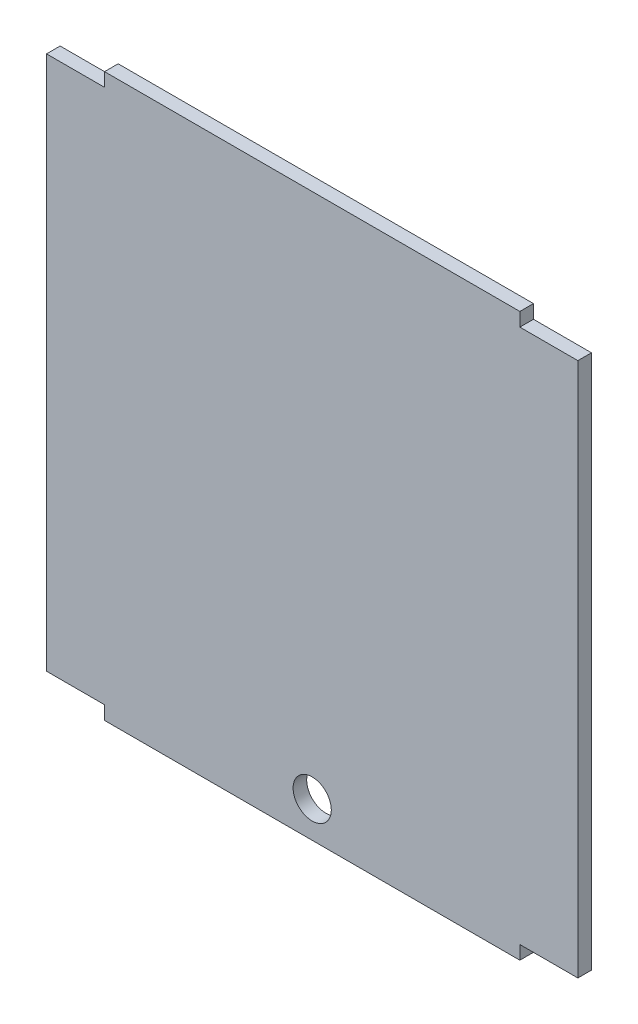
ISO-10303-21;
HEADER;
FILE_DESCRIPTION(('STEP AP214'),'2;1');
FILE_NAME('part.step','',(''),(''),'','','');
FILE_SCHEMA(('AUTOMOTIVE_DESIGN { 1 0 10303 214 1 1 1 1 }'));
ENDSEC;
DATA;
#1=APPLICATION_CONTEXT('core data for automotive mechanical design processes');
#2=APPLICATION_PROTOCOL_DEFINITION('international standard','automotive_design',2000,#1);
#3=PRODUCT_CONTEXT('',#1,'mechanical');
#4=PRODUCT('Part','Part','',(#3));
#5=PRODUCT_RELATED_PRODUCT_CATEGORY('part','',(#4));
#6=PRODUCT_DEFINITION_FORMATION('','',#4);
#7=PRODUCT_DEFINITION_CONTEXT('part definition',#1,'design');
#8=PRODUCT_DEFINITION('design','',#6,#7);
#9=PRODUCT_DEFINITION_SHAPE('','',#8);
#10=(LENGTH_UNIT() NAMED_UNIT(*) SI_UNIT(.MILLI.,.METRE.));
#11=(NAMED_UNIT(*) PLANE_ANGLE_UNIT() SI_UNIT($,.RADIAN.));
#12=(NAMED_UNIT(*) SI_UNIT($,.STERADIAN.) SOLID_ANGLE_UNIT());
#13=UNCERTAINTY_MEASURE_WITH_UNIT(LENGTH_MEASURE(1.E-05),#10,'distance_accuracy_value','');
#14=(GEOMETRIC_REPRESENTATION_CONTEXT(3) GLOBAL_UNCERTAINTY_ASSIGNED_CONTEXT((#13)) GLOBAL_UNIT_ASSIGNED_CONTEXT((#10,
#11,#12)) REPRESENTATION_CONTEXT('',''));
#15=CARTESIAN_POINT('',(0.,0.,0.));
#16=DIRECTION('',(0.,0.,1.));
#17=DIRECTION('',(1.,0.,0.));
#18=AXIS2_PLACEMENT_3D('',#15,#16,#17);
#19=CARTESIAN_POINT('',(0.,0.,5.7));
#20=DIRECTION('',(1.,0.,0.));
#21=DIRECTION('',(0.,0.,-1.));
#22=AXIS2_PLACEMENT_3D('',#19,#20,#21);
#23=PLANE('',#22);
#24=DIRECTION('',(0.,-1.,0.));
#25=VECTOR('',#24,1.);
#26=CARTESIAN_POINT('',(0.,0.,0.));
#27=LINE('',#26,#25);
#28=CARTESIAN_POINT('',(0.,224.,0.));
#29=VERTEX_POINT('',#28);
#30=CARTESIAN_POINT('',(0.,0.,0.));
#31=VERTEX_POINT('',#30);
#32=EDGE_CURVE('E152',#29,#31,#27,.T.);
#33=ORIENTED_EDGE('',*,*,#32,.T.);
#34=DIRECTION('',(0.,0.,-1.));
#35=VECTOR('',#34,1.);
#36=CARTESIAN_POINT('',(0.,0.,5.7));
#37=LINE('',#36,#35);
#38=CARTESIAN_POINT('',(0.,0.,5.7));
#39=VERTEX_POINT('',#38);
#40=EDGE_CURVE('E11',#39,#31,#37,.T.);
#41=ORIENTED_EDGE('',*,*,#40,.F.);
#42=DIRECTION('',(0.,-1.,0.));
#43=VECTOR('',#42,1.);
#44=CARTESIAN_POINT('',(0.,0.,5.7));
#45=LINE('',#44,#43);
#46=CARTESIAN_POINT('',(0.,224.,5.7));
#47=VERTEX_POINT('',#46);
#48=EDGE_CURVE('E175',#47,#39,#45,.T.);
#49=ORIENTED_EDGE('',*,*,#48,.F.);
#50=DIRECTION('',(0.,0.,-1.));
#51=VECTOR('',#50,1.);
#52=CARTESIAN_POINT('',(0.,224.,5.7));
#53=LINE('',#52,#51);
#54=EDGE_CURVE('E148',#47,#29,#53,.T.);
#55=ORIENTED_EDGE('',*,*,#54,.T.);
#56=EDGE_LOOP('',(#33,#41,#49,#55));
#57=FACE_BOUND('',#56,.T.);
#58=ADVANCED_FACE('F32',(#57),#23,.F.);
#59=CARTESIAN_POINT('',(0.,0.,5.7));
#60=DIRECTION('',(0.,1.,0.));
#61=DIRECTION('',(0.,0.,1.));
#62=AXIS2_PLACEMENT_3D('',#59,#60,#61);
#63=PLANE('',#62);
#64=DIRECTION('',(1.,0.,0.));
#65=VECTOR('',#64,1.);
#66=CARTESIAN_POINT('',(0.,0.,0.));
#67=LINE('',#66,#65);
#68=CARTESIAN_POINT('',(24.3,0.,0.));
#69=VERTEX_POINT('',#68);
#70=EDGE_CURVE('E155',#31,#69,#67,.T.);
#71=ORIENTED_EDGE('',*,*,#70,.T.);
#72=DIRECTION('',(0.,0.,-1.));
#73=VECTOR('',#72,1.);
#74=CARTESIAN_POINT('',(24.3,0.,5.7));
#75=LINE('',#74,#73);
#76=CARTESIAN_POINT('',(24.3,0.,5.7));
#77=VERTEX_POINT('',#76);
#78=EDGE_CURVE('E40',#77,#69,#75,.T.);
#79=ORIENTED_EDGE('',*,*,#78,.F.);
#80=DIRECTION('',(1.,0.,0.));
#81=VECTOR('',#80,1.);
#82=CARTESIAN_POINT('',(0.,0.,5.7));
#83=LINE('',#82,#81);
#84=EDGE_CURVE('E103',#39,#77,#83,.T.);
#85=ORIENTED_EDGE('',*,*,#84,.F.);
#86=ORIENTED_EDGE('',*,*,#40,.T.);
#87=EDGE_LOOP('',(#71,#79,#85,#86));
#88=FACE_BOUND('',#87,.T.);
#89=ADVANCED_FACE('F254',(#88),#63,.F.);
#90=CARTESIAN_POINT('',(24.3,0.,5.7));
#91=DIRECTION('',(1.,0.,0.));
#92=DIRECTION('',(0.,0.,-1.));
#93=AXIS2_PLACEMENT_3D('',#90,#91,#92);
#94=PLANE('',#93);
#95=DIRECTION('',(0.,-1.,0.));
#96=VECTOR('',#95,1.);
#97=CARTESIAN_POINT('',(24.3,0.,0.));
#98=LINE('',#97,#96);
#99=CARTESIAN_POINT('',(24.3,-5.7,0.));
#100=VERTEX_POINT('',#99);
#101=EDGE_CURVE('E158',#69,#100,#98,.T.);
#102=ORIENTED_EDGE('',*,*,#101,.T.);
#103=DIRECTION('',(0.,0.,-1.));
#104=VECTOR('',#103,1.);
#105=CARTESIAN_POINT('',(24.3,-5.7,5.7));
#106=LINE('',#105,#104);
#107=CARTESIAN_POINT('',(24.3,-5.7,5.7));
#108=VERTEX_POINT('',#107);
#109=EDGE_CURVE('E194',#108,#100,#106,.T.);
#110=ORIENTED_EDGE('',*,*,#109,.F.);
#111=DIRECTION('',(0.,-1.,0.));
#112=VECTOR('',#111,1.);
#113=CARTESIAN_POINT('',(24.3,0.,5.7));
#114=LINE('',#113,#112);
#115=EDGE_CURVE('E202',#77,#108,#114,.T.);
#116=ORIENTED_EDGE('',*,*,#115,.F.);
#117=ORIENTED_EDGE('',*,*,#78,.T.);
#118=EDGE_LOOP('',(#102,#110,#116,#117));
#119=FACE_BOUND('',#118,.T.);
#120=ADVANCED_FACE('F200',(#119),#94,.F.);
#121=CARTESIAN_POINT('',(24.3,-5.7,5.7));
#122=DIRECTION('',(0.,1.,0.));
#123=DIRECTION('',(0.,0.,1.));
#124=AXIS2_PLACEMENT_3D('',#121,#122,#123);
#125=PLANE('',#124);
#126=DIRECTION('',(1.,0.,0.));
#127=VECTOR('',#126,1.);
#128=CARTESIAN_POINT('',(24.3,-5.7,0.));
#129=LINE('',#128,#127);
#130=CARTESIAN_POINT('',(198.3,-5.7,0.));
#131=VERTEX_POINT('',#130);
#132=EDGE_CURVE('E160',#100,#131,#129,.T.);
#133=ORIENTED_EDGE('',*,*,#132,.T.);
#134=DIRECTION('',(0.,0.,-1.));
#135=VECTOR('',#134,1.);
#136=CARTESIAN_POINT('',(198.3,-5.7,5.7));
#137=LINE('',#136,#135);
#138=CARTESIAN_POINT('',(198.3,-5.7,5.7));
#139=VERTEX_POINT('',#138);
#140=EDGE_CURVE('E191',#139,#131,#137,.T.);
#141=ORIENTED_EDGE('',*,*,#140,.F.);
#142=DIRECTION('',(1.,0.,0.));
#143=VECTOR('',#142,1.);
#144=CARTESIAN_POINT('',(24.3,-5.7,5.7));
#145=LINE('',#144,#143);
#146=EDGE_CURVE('E220',#108,#139,#145,.T.);
#147=ORIENTED_EDGE('',*,*,#146,.F.);
#148=ORIENTED_EDGE('',*,*,#109,.T.);
#149=EDGE_LOOP('',(#133,#141,#147,#148));
#150=FACE_BOUND('',#149,.T.);
#151=ADVANCED_FACE('F211',(#150),#125,.F.);
#152=CARTESIAN_POINT('',(198.3,0.,5.7));
#153=DIRECTION('',(-1.,0.,0.));
#154=DIRECTION('',(0.,0.,1.));
#155=AXIS2_PLACEMENT_3D('',#152,#153,#154);
#156=PLANE('',#155);
#157=DIRECTION('',(0.,1.,0.));
#158=VECTOR('',#157,1.);
#159=CARTESIAN_POINT('',(198.3,0.,0.));
#160=LINE('',#159,#158);
#161=CARTESIAN_POINT('',(198.3,0.,0.));
#162=VERTEX_POINT('',#161);
#163=EDGE_CURVE('E162',#131,#162,#160,.T.);
#164=ORIENTED_EDGE('',*,*,#163,.T.);
#165=DIRECTION('',(0.,0.,-1.));
#166=VECTOR('',#165,1.);
#167=CARTESIAN_POINT('',(198.3,0.,5.7));
#168=LINE('',#167,#166);
#169=CARTESIAN_POINT('',(198.3,0.,5.7));
#170=VERTEX_POINT('',#169);
#171=EDGE_CURVE('E188',#170,#162,#168,.T.);
#172=ORIENTED_EDGE('',*,*,#171,.F.);
#173=DIRECTION('',(0.,1.,0.));
#174=VECTOR('',#173,1.);
#175=CARTESIAN_POINT('',(198.3,0.,5.7));
#176=LINE('',#175,#174);
#177=EDGE_CURVE('E217',#139,#170,#176,.T.);
#178=ORIENTED_EDGE('',*,*,#177,.F.);
#179=ORIENTED_EDGE('',*,*,#140,.T.);
#180=EDGE_LOOP('',(#164,#172,#178,#179));
#181=FACE_BOUND('',#180,.T.);
#182=ADVANCED_FACE('F215',(#181),#156,.F.);
#183=CARTESIAN_POINT('',(198.3,0.,5.7));
#184=DIRECTION('',(0.,1.,0.));
#185=DIRECTION('',(0.,0.,1.));
#186=AXIS2_PLACEMENT_3D('',#183,#184,#185);
#187=PLANE('',#186);
#188=DIRECTION('',(1.,0.,0.));
#189=VECTOR('',#188,1.);
#190=CARTESIAN_POINT('',(198.3,0.,0.));
#191=LINE('',#190,#189);
#192=CARTESIAN_POINT('',(222.6,0.,0.));
#193=VERTEX_POINT('',#192);
#194=EDGE_CURVE('E164',#162,#193,#191,.T.);
#195=ORIENTED_EDGE('',*,*,#194,.T.);
#196=DIRECTION('',(0.,0.,-1.));
#197=VECTOR('',#196,1.);
#198=CARTESIAN_POINT('',(222.6,0.,5.7));
#199=LINE('',#198,#197);
#200=CARTESIAN_POINT('',(222.6,0.,5.7));
#201=VERTEX_POINT('',#200);
#202=EDGE_CURVE('E185',#201,#193,#199,.T.);
#203=ORIENTED_EDGE('',*,*,#202,.F.);
#204=DIRECTION('',(1.,0.,0.));
#205=VECTOR('',#204,1.);
#206=CARTESIAN_POINT('',(198.3,0.,5.7));
#207=LINE('',#206,#205);
#208=EDGE_CURVE('E219',#170,#201,#207,.T.);
#209=ORIENTED_EDGE('',*,*,#208,.F.);
#210=ORIENTED_EDGE('',*,*,#171,.T.);
#211=EDGE_LOOP('',(#195,#203,#209,#210));
#212=FACE_BOUND('',#211,.T.);
#213=ADVANCED_FACE('F267',(#212),#187,.F.);
#214=CARTESIAN_POINT('',(222.6,0.,5.7));
#215=DIRECTION('',(-1.,0.,0.));
#216=DIRECTION('',(0.,0.,1.));
#217=AXIS2_PLACEMENT_3D('',#214,#215,#216);
#218=PLANE('',#217);
#219=DIRECTION('',(0.,1.,0.));
#220=VECTOR('',#219,1.);
#221=CARTESIAN_POINT('',(222.6,0.,0.));
#222=LINE('',#221,#220);
#223=CARTESIAN_POINT('',(222.6,224.,0.));
#224=VERTEX_POINT('',#223);
#225=EDGE_CURVE('E166',#193,#224,#222,.T.);
#226=ORIENTED_EDGE('',*,*,#225,.T.);
#227=DIRECTION('',(0.,0.,-1.));
#228=VECTOR('',#227,1.);
#229=CARTESIAN_POINT('',(222.6,224.,5.7));
#230=LINE('',#229,#228);
#231=CARTESIAN_POINT('',(222.6,224.,5.7));
#232=VERTEX_POINT('',#231);
#233=EDGE_CURVE('E182',#232,#224,#230,.T.);
#234=ORIENTED_EDGE('',*,*,#233,.F.);
#235=DIRECTION('',(0.,1.,0.));
#236=VECTOR('',#235,1.);
#237=CARTESIAN_POINT('',(222.6,0.,5.7));
#238=LINE('',#237,#236);
#239=EDGE_CURVE('E222',#201,#232,#238,.T.);
#240=ORIENTED_EDGE('',*,*,#239,.F.);
#241=ORIENTED_EDGE('',*,*,#202,.T.);
#242=EDGE_LOOP('',(#226,#234,#240,#241));
#243=FACE_BOUND('',#242,.T.);
#244=ADVANCED_FACE('F270',(#243),#218,.F.);
#245=CARTESIAN_POINT('',(198.3,224.,5.7));
#246=DIRECTION('',(0.,-1.,0.));
#247=DIRECTION('',(0.,0.,-1.));
#248=AXIS2_PLACEMENT_3D('',#245,#246,#247);
#249=PLANE('',#248);
#250=DIRECTION('',(-1.,0.,0.));
#251=VECTOR('',#250,1.);
#252=CARTESIAN_POINT('',(198.3,224.,0.));
#253=LINE('',#252,#251);
#254=CARTESIAN_POINT('',(198.3,224.,0.));
#255=VERTEX_POINT('',#254);
#256=EDGE_CURVE('E168',#224,#255,#253,.T.);
#257=ORIENTED_EDGE('',*,*,#256,.T.);
#258=DIRECTION('',(0.,0.,-1.));
#259=VECTOR('',#258,1.);
#260=CARTESIAN_POINT('',(198.3,224.,5.7));
#261=LINE('',#260,#259);
#262=CARTESIAN_POINT('',(198.3,224.,5.7));
#263=VERTEX_POINT('',#262);
#264=EDGE_CURVE('E179',#263,#255,#261,.T.);
#265=ORIENTED_EDGE('',*,*,#264,.F.);
#266=DIRECTION('',(-1.,0.,0.));
#267=VECTOR('',#266,1.);
#268=CARTESIAN_POINT('',(198.3,224.,5.7));
#269=LINE('',#268,#267);
#270=EDGE_CURVE('E228',#232,#263,#269,.T.);
#271=ORIENTED_EDGE('',*,*,#270,.F.);
#272=ORIENTED_EDGE('',*,*,#233,.T.);
#273=EDGE_LOOP('',(#257,#265,#271,#272));
#274=FACE_BOUND('',#273,.T.);
#275=ADVANCED_FACE('F234',(#274),#249,.F.);
#276=CARTESIAN_POINT('',(198.3,224.,5.7));
#277=DIRECTION('',(-1.,0.,0.));
#278=DIRECTION('',(0.,0.,1.));
#279=AXIS2_PLACEMENT_3D('',#276,#277,#278);
#280=PLANE('',#279);
#281=DIRECTION('',(0.,1.,0.));
#282=VECTOR('',#281,1.);
#283=CARTESIAN_POINT('',(198.3,224.,0.));
#284=LINE('',#283,#282);
#285=CARTESIAN_POINT('',(198.3,229.7,0.));
#286=VERTEX_POINT('',#285);
#287=EDGE_CURVE('E170',#255,#286,#284,.T.);
#288=ORIENTED_EDGE('',*,*,#287,.T.);
#289=DIRECTION('',(0.,0.,-1.));
#290=VECTOR('',#289,1.);
#291=CARTESIAN_POINT('',(198.3,229.7,5.7));
#292=LINE('',#291,#290);
#293=CARTESIAN_POINT('',(198.3,229.7,5.7));
#294=VERTEX_POINT('',#293);
#295=EDGE_CURVE('E143',#294,#286,#292,.T.);
#296=ORIENTED_EDGE('',*,*,#295,.F.);
#297=DIRECTION('',(0.,1.,0.));
#298=VECTOR('',#297,1.);
#299=CARTESIAN_POINT('',(198.3,224.,5.7));
#300=LINE('',#299,#298);
#301=EDGE_CURVE('E134',#263,#294,#300,.T.);
#302=ORIENTED_EDGE('',*,*,#301,.F.);
#303=ORIENTED_EDGE('',*,*,#264,.T.);
#304=EDGE_LOOP('',(#288,#296,#302,#303));
#305=FACE_BOUND('',#304,.T.);
#306=ADVANCED_FACE('F238',(#305),#280,.F.);
#307=CARTESIAN_POINT('',(24.3,229.7,5.7));
#308=DIRECTION('',(0.,-1.,0.));
#309=DIRECTION('',(0.,0.,-1.));
#310=AXIS2_PLACEMENT_3D('',#307,#308,#309);
#311=PLANE('',#310);
#312=DIRECTION('',(-1.,0.,0.));
#313=VECTOR('',#312,1.);
#314=CARTESIAN_POINT('',(24.3,229.7,0.));
#315=LINE('',#314,#313);
#316=CARTESIAN_POINT('',(24.3,229.7,0.));
#317=VERTEX_POINT('',#316);
#318=EDGE_CURVE('E142',#286,#317,#315,.T.);
#319=ORIENTED_EDGE('',*,*,#318,.T.);
#320=DIRECTION('',(0.,0.,-1.));
#321=VECTOR('',#320,1.);
#322=CARTESIAN_POINT('',(24.3,229.7,5.7));
#323=LINE('',#322,#321);
#324=CARTESIAN_POINT('',(24.3,229.7,5.7));
#325=VERTEX_POINT('',#324);
#326=EDGE_CURVE('E139',#325,#317,#323,.T.);
#327=ORIENTED_EDGE('',*,*,#326,.F.);
#328=DIRECTION('',(-1.,0.,0.));
#329=VECTOR('',#328,1.);
#330=CARTESIAN_POINT('',(24.3,229.7,5.7));
#331=LINE('',#330,#329);
#332=EDGE_CURVE('E128',#294,#325,#331,.T.);
#333=ORIENTED_EDGE('',*,*,#332,.F.);
#334=ORIENTED_EDGE('',*,*,#295,.T.);
#335=EDGE_LOOP('',(#319,#327,#333,#334));
#336=FACE_BOUND('',#335,.T.);
#337=ADVANCED_FACE('F140',(#336),#311,.F.);
#338=CARTESIAN_POINT('',(24.3,224.,5.7));
#339=DIRECTION('',(1.,0.,0.));
#340=DIRECTION('',(0.,0.,-1.));
#341=AXIS2_PLACEMENT_3D('',#338,#339,#340);
#342=PLANE('',#341);
#343=DIRECTION('',(0.,-1.,0.));
#344=VECTOR('',#343,1.);
#345=CARTESIAN_POINT('',(24.3,224.,0.));
#346=LINE('',#345,#344);
#347=CARTESIAN_POINT('',(24.3,224.,0.));
#348=VERTEX_POINT('',#347);
#349=EDGE_CURVE('E89',#317,#348,#346,.T.);
#350=ORIENTED_EDGE('',*,*,#349,.T.);
#351=DIRECTION('',(0.,0.,-1.));
#352=VECTOR('',#351,1.);
#353=CARTESIAN_POINT('',(24.3,224.,5.7));
#354=LINE('',#353,#352);
#355=CARTESIAN_POINT('',(24.3,224.,5.7));
#356=VERTEX_POINT('',#355);
#357=EDGE_CURVE('E144',#356,#348,#354,.T.);
#358=ORIENTED_EDGE('',*,*,#357,.F.);
#359=DIRECTION('',(0.,-1.,0.));
#360=VECTOR('',#359,1.);
#361=CARTESIAN_POINT('',(24.3,224.,5.7));
#362=LINE('',#361,#360);
#363=EDGE_CURVE('E132',#325,#356,#362,.T.);
#364=ORIENTED_EDGE('',*,*,#363,.F.);
#365=ORIENTED_EDGE('',*,*,#326,.T.);
#366=EDGE_LOOP('',(#350,#358,#364,#365));
#367=FACE_BOUND('',#366,.T.);
#368=ADVANCED_FACE('F146',(#367),#342,.F.);
#369=CARTESIAN_POINT('',(0.,224.,5.7));
#370=DIRECTION('',(0.,-1.,0.));
#371=DIRECTION('',(0.,0.,-1.));
#372=AXIS2_PLACEMENT_3D('',#369,#370,#371);
#373=PLANE('',#372);
#374=DIRECTION('',(-1.,0.,0.));
#375=VECTOR('',#374,1.);
#376=CARTESIAN_POINT('',(0.,224.,0.));
#377=LINE('',#376,#375);
#378=EDGE_CURVE('E95',#348,#29,#377,.T.);
#379=ORIENTED_EDGE('',*,*,#378,.T.);
#380=ORIENTED_EDGE('',*,*,#54,.F.);
#381=DIRECTION('',(-1.,0.,0.));
#382=VECTOR('',#381,1.);
#383=CARTESIAN_POINT('',(0.,224.,5.7));
#384=LINE('',#383,#382);
#385=EDGE_CURVE('E48',#356,#47,#384,.T.);
#386=ORIENTED_EDGE('',*,*,#385,.F.);
#387=ORIENTED_EDGE('',*,*,#357,.T.);
#388=EDGE_LOOP('',(#379,#380,#386,#387));
#389=FACE_BOUND('',#388,.T.);
#390=ADVANCED_FACE('F242',(#389),#373,.F.);
#391=CARTESIAN_POINT('',(0.,0.,5.7));
#392=DIRECTION('',(0.,0.,-1.));
#393=DIRECTION('',(-1.,0.,0.));
#394=AXIS2_PLACEMENT_3D('',#391,#392,#393);
#395=PLANE('',#394);
#396=CARTESIAN_POINT('',(111.3,9.3,5.7));
#397=DIRECTION('',(0.,0.,1.));
#398=DIRECTION('',(1.,0.,0.));
#399=AXIS2_PLACEMENT_3D('',#396,#397,#398);
#400=CIRCLE('',#399,8.);
#401=CARTESIAN_POINT('',(119.3,9.3,5.7));
#402=VERTEX_POINT('',#401);
#403=EDGE_CURVE('E325',#402,#402,#400,.T.);
#404=ORIENTED_EDGE('',*,*,#403,.F.);
#405=EDGE_LOOP('',(#404));
#406=FACE_BOUND('',#405,.T.);
#407=ORIENTED_EDGE('',*,*,#48,.T.);
#408=ORIENTED_EDGE('',*,*,#84,.T.);
#409=ORIENTED_EDGE('',*,*,#115,.T.);
#410=ORIENTED_EDGE('',*,*,#146,.T.);
#411=ORIENTED_EDGE('',*,*,#177,.T.);
#412=ORIENTED_EDGE('',*,*,#208,.T.);
#413=ORIENTED_EDGE('',*,*,#239,.T.);
#414=ORIENTED_EDGE('',*,*,#270,.T.);
#415=ORIENTED_EDGE('',*,*,#301,.T.);
#416=ORIENTED_EDGE('',*,*,#332,.T.);
#417=ORIENTED_EDGE('',*,*,#363,.T.);
#418=ORIENTED_EDGE('',*,*,#385,.T.);
#419=EDGE_LOOP('',(#407,#408,#409,#410,#411,#412,#413,#414,#415,#416,#417,#418));
#420=FACE_BOUND('',#419,.T.);
#421=ADVANCED_FACE('F130',(#406,#420),#395,.F.);
#422=CARTESIAN_POINT('',(0.,0.,0.));
#423=DIRECTION('',(0.,0.,-1.));
#424=DIRECTION('',(-1.,0.,0.));
#425=AXIS2_PLACEMENT_3D('',#422,#423,#424);
#426=PLANE('',#425);
#427=CARTESIAN_POINT('',(111.3,9.3,0.));
#428=DIRECTION('',(0.,0.,1.));
#429=DIRECTION('',(1.,0.,0.));
#430=AXIS2_PLACEMENT_3D('',#427,#428,#429);
#431=CIRCLE('',#430,8.);
#432=CARTESIAN_POINT('',(119.3,9.3,0.));
#433=VERTEX_POINT('',#432);
#434=EDGE_CURVE('E156',#433,#433,#431,.T.);
#435=ORIENTED_EDGE('',*,*,#434,.T.);
#436=EDGE_LOOP('',(#435));
#437=FACE_BOUND('',#436,.T.);
#438=ORIENTED_EDGE('',*,*,#32,.F.);
#439=ORIENTED_EDGE('',*,*,#378,.F.);
#440=ORIENTED_EDGE('',*,*,#349,.F.);
#441=ORIENTED_EDGE('',*,*,#318,.F.);
#442=ORIENTED_EDGE('',*,*,#287,.F.);
#443=ORIENTED_EDGE('',*,*,#256,.F.);
#444=ORIENTED_EDGE('',*,*,#225,.F.);
#445=ORIENTED_EDGE('',*,*,#194,.F.);
#446=ORIENTED_EDGE('',*,*,#163,.F.);
#447=ORIENTED_EDGE('',*,*,#132,.F.);
#448=ORIENTED_EDGE('',*,*,#101,.F.);
#449=ORIENTED_EDGE('',*,*,#70,.F.);
#450=EDGE_LOOP('',(#438,#439,#440,#441,#442,#443,#444,#445,#446,#447,#448,#449));
#451=FACE_BOUND('',#450,.T.);
#452=ADVANCED_FACE('F206',(#437,#451),#426,.T.);
#453=CARTESIAN_POINT('',(111.3,9.3,0.));
#454=DIRECTION('',(0.,0.,1.));
#455=DIRECTION('',(1.,0.,0.));
#456=AXIS2_PLACEMENT_3D('',#453,#454,#455);
#457=CYLINDRICAL_SURFACE('',#456,8.);
#458=ORIENTED_EDGE('',*,*,#434,.F.);
#459=EDGE_LOOP('',(#458));
#460=FACE_BOUND('',#459,.T.);
#461=ORIENTED_EDGE('',*,*,#403,.T.);
#462=EDGE_LOOP('',(#461));
#463=FACE_BOUND('',#462,.T.);
#464=ADVANCED_FACE('F307',(#460,#463),#457,.F.);
#465=CLOSED_SHELL('',(#58,#89,#120,#151,#182,#213,#244,#275,#306,#337,#368,#390,#421,#452,#464));
#466=MANIFOLD_SOLID_BREP('B2',#465);
#467=ADVANCED_BREP_SHAPE_REPRESENTATION('',(#18,#466),#14);
#468=SHAPE_DEFINITION_REPRESENTATION(#9,#467);
ENDSEC;
END-ISO-10303-21;
